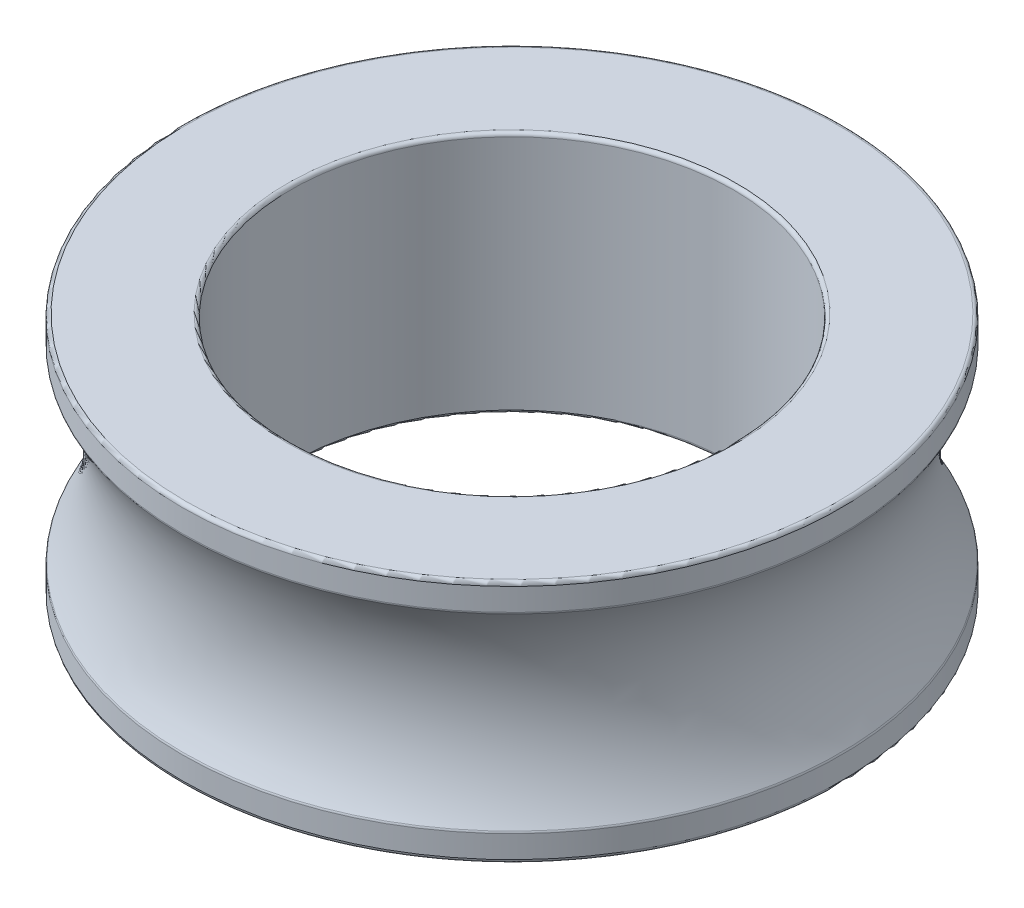
ISO-10303-21;
HEADER;
FILE_DESCRIPTION(('STEP AP214'),'2;1');
FILE_NAME('part.step','',(''),(''),'','','');
FILE_SCHEMA(('AUTOMOTIVE_DESIGN { 1 0 10303 214 1 1 1 1 }'));
ENDSEC;
DATA;
#1=APPLICATION_CONTEXT('core data for automotive mechanical design processes');
#2=APPLICATION_PROTOCOL_DEFINITION('international standard','automotive_design',2000,#1);
#3=PRODUCT_CONTEXT('',#1,'mechanical');
#4=PRODUCT('Part','Part','',(#3));
#5=PRODUCT_RELATED_PRODUCT_CATEGORY('part','',(#4));
#6=PRODUCT_DEFINITION_FORMATION('','',#4);
#7=PRODUCT_DEFINITION_CONTEXT('part definition',#1,'design');
#8=PRODUCT_DEFINITION('design','',#6,#7);
#9=PRODUCT_DEFINITION_SHAPE('','',#8);
#10=(LENGTH_UNIT() NAMED_UNIT(*) SI_UNIT(.MILLI.,.METRE.));
#11=(NAMED_UNIT(*) PLANE_ANGLE_UNIT() SI_UNIT($,.RADIAN.));
#12=(NAMED_UNIT(*) SI_UNIT($,.STERADIAN.) SOLID_ANGLE_UNIT());
#13=UNCERTAINTY_MEASURE_WITH_UNIT(LENGTH_MEASURE(1.E-05),#10,'distance_accuracy_value','');
#14=(GEOMETRIC_REPRESENTATION_CONTEXT(3) GLOBAL_UNCERTAINTY_ASSIGNED_CONTEXT((#13)) GLOBAL_UNIT_ASSIGNED_CONTEXT((#10,
#11,#12)) REPRESENTATION_CONTEXT('',''));
#15=CARTESIAN_POINT('',(0.,0.,0.));
#16=DIRECTION('',(0.,0.,1.));
#17=DIRECTION('',(1.,0.,0.));
#18=AXIS2_PLACEMENT_3D('',#15,#16,#17);
#19=CARTESIAN_POINT('',(0.,0.,0.));
#20=DIRECTION('',(0.,-1.,0.));
#21=DIRECTION('',(0.,0.,-1.));
#22=AXIS2_PLACEMENT_3D('',#19,#20,#21);
#23=CYLINDRICAL_SURFACE('',#22,6.125);
#24=CARTESIAN_POINT('',(0.,0.1,0.));
#25=DIRECTION('',(0.,-1.,0.));
#26=DIRECTION('',(0.,0.,-1.));
#27=AXIS2_PLACEMENT_3D('',#24,#25,#26);
#28=CIRCLE('',#27,6.125);
#29=CARTESIAN_POINT('',(0.,0.1,-6.125));
#30=VERTEX_POINT('',#29);
#31=EDGE_CURVE('E68',#30,#30,#28,.T.);
#32=ORIENTED_EDGE('',*,*,#31,.T.);
#33=EDGE_LOOP('',(#32));
#34=FACE_BOUND('',#33,.T.);
#35=CARTESIAN_POINT('',(0.,6.65,0.));
#36=DIRECTION('',(0.,1.,0.));
#37=DIRECTION('',(0.,0.,1.));
#38=AXIS2_PLACEMENT_3D('',#35,#36,#37);
#39=CIRCLE('',#38,6.125);
#40=CARTESIAN_POINT('',(0.,6.65,6.125));
#41=VERTEX_POINT('',#40);
#42=EDGE_CURVE('E71',#41,#41,#39,.T.);
#43=ORIENTED_EDGE('',*,*,#42,.T.);
#44=EDGE_LOOP('',(#43));
#45=FACE_BOUND('',#44,.T.);
#46=ADVANCED_FACE('F30',(#34,#45),#23,.F.);
#47=CARTESIAN_POINT('',(6.125,0.,0.));
#48=DIRECTION('',(0.,-1.,0.));
#49=DIRECTION('',(0.,0.,-1.));
#50=AXIS2_PLACEMENT_3D('',#47,#48,#49);
#51=PLANE('',#50);
#52=CARTESIAN_POINT('',(0.,0.,0.));
#53=DIRECTION('',(0.,-1.,0.));
#54=DIRECTION('',(0.,0.,-1.));
#55=AXIS2_PLACEMENT_3D('',#52,#53,#54);
#56=CIRCLE('',#55,6.225);
#57=CARTESIAN_POINT('',(0.,0.,-6.225));
#58=VERTEX_POINT('',#57);
#59=EDGE_CURVE('E62',#58,#58,#56,.F.);
#60=ORIENTED_EDGE('',*,*,#59,.T.);
#61=EDGE_LOOP('',(#60));
#62=FACE_BOUND('',#61,.T.);
#63=CARTESIAN_POINT('',(0.,0.,0.));
#64=DIRECTION('',(0.,-1.,0.));
#65=DIRECTION('',(0.,0.,-1.));
#66=AXIS2_PLACEMENT_3D('',#63,#64,#65);
#67=CIRCLE('',#66,9.025);
#68=CARTESIAN_POINT('',(0.,0.,-9.025));
#69=VERTEX_POINT('',#68);
#70=EDGE_CURVE('E65',#69,#69,#67,.T.);
#71=ORIENTED_EDGE('',*,*,#70,.T.);
#72=EDGE_LOOP('',(#71));
#73=FACE_BOUND('',#72,.T.);
#74=ADVANCED_FACE('F85',(#62,#73),#51,.T.);
#75=CARTESIAN_POINT('',(0.,0.,0.));
#76=DIRECTION('',(0.,-1.,0.));
#77=DIRECTION('',(0.,0.,-1.));
#78=AXIS2_PLACEMENT_3D('',#75,#76,#77);
#79=CYLINDRICAL_SURFACE('',#78,9.125);
#80=CARTESIAN_POINT('',(0.,0.1,0.));
#81=DIRECTION('',(0.,-1.,0.));
#82=DIRECTION('',(0.,0.,-1.));
#83=AXIS2_PLACEMENT_3D('',#80,#81,#82);
#84=CIRCLE('',#83,9.125);
#85=CARTESIAN_POINT('',(0.,0.1,-9.125));
#86=VERTEX_POINT('',#85);
#87=EDGE_CURVE('E56',#86,#86,#84,.F.);
#88=ORIENTED_EDGE('',*,*,#87,.T.);
#89=EDGE_LOOP('',(#88));
#90=FACE_BOUND('',#89,.T.);
#91=CARTESIAN_POINT('',(0.,0.72179009999726,0.));
#92=DIRECTION('',(0.,1.,0.));
#93=DIRECTION('',(0.,0.,1.));
#94=AXIS2_PLACEMENT_3D('',#91,#92,#93);
#95=CIRCLE('',#94,9.125);
#96=CARTESIAN_POINT('',(0.,0.72179009999726,9.125));
#97=VERTEX_POINT('',#96);
#98=EDGE_CURVE('E59',#97,#97,#95,.F.);
#99=ORIENTED_EDGE('',*,*,#98,.T.);
#100=EDGE_LOOP('',(#99));
#101=FACE_BOUND('',#100,.T.);
#102=ADVANCED_FACE('F91',(#90,#101),#79,.T.);
#103=CARTESIAN_POINT('',(0.,3.375,0.));
#104=DIRECTION('',(0.,-1.,0.));
#105=DIRECTION('',(0.,0.,-1.));
#106=AXIS2_PLACEMENT_3D('',#103,#104,#105);
#107=TOROIDAL_SURFACE('',#106,13.3805111326373,5.);
#108=CARTESIAN_POINT('',(0.,0.773813823526725,0.));
#109=DIRECTION('',(0.,1.,0.));
#110=DIRECTION('',(0.,0.,1.));
#111=AXIS2_PLACEMENT_3D('',#108,#109,#110);
#112=CIRCLE('',#111,9.11040217907132);
#113=CARTESIAN_POINT('',(0.,0.773813823526725,9.11040217907132));
#114=VERTEX_POINT('',#113);
#115=EDGE_CURVE('E50',#114,#114,#112,.T.);
#116=ORIENTED_EDGE('',*,*,#115,.T.);
#117=EDGE_LOOP('',(#116));
#118=FACE_BOUND('',#117,.T.);
#119=CARTESIAN_POINT('',(0.,5.97618617647327,0.));
#120=DIRECTION('',(0.,-1.,0.));
#121=DIRECTION('',(0.,0.,-1.));
#122=AXIS2_PLACEMENT_3D('',#119,#120,#121);
#123=CIRCLE('',#122,9.11040217907133);
#124=CARTESIAN_POINT('',(0.,5.97618617647327,-9.11040217907133));
#125=VERTEX_POINT('',#124);
#126=EDGE_CURVE('E53',#125,#125,#123,.T.);
#127=ORIENTED_EDGE('',*,*,#126,.T.);
#128=EDGE_LOOP('',(#127));
#129=FACE_BOUND('',#128,.T.);
#130=ADVANCED_FACE('F117',(#118,#129),#107,.F.);
#131=CARTESIAN_POINT('',(0.,0.,0.));
#132=DIRECTION('',(0.,-1.,0.));
#133=DIRECTION('',(0.,0.,-1.));
#134=AXIS2_PLACEMENT_3D('',#131,#132,#133);
#135=CYLINDRICAL_SURFACE('',#134,9.125);
#136=CARTESIAN_POINT('',(0.,6.02820990000274,0.));
#137=DIRECTION('',(0.,1.,0.));
#138=DIRECTION('',(0.,0.,1.));
#139=AXIS2_PLACEMENT_3D('',#136,#137,#138);
#140=CIRCLE('',#139,9.125);
#141=CARTESIAN_POINT('',(0.,6.02820990000274,9.125));
#142=VERTEX_POINT('',#141);
#143=EDGE_CURVE('E41',#142,#142,#140,.T.);
#144=ORIENTED_EDGE('',*,*,#143,.T.);
#145=EDGE_LOOP('',(#144));
#146=FACE_BOUND('',#145,.T.);
#147=CARTESIAN_POINT('',(0.,6.65,0.));
#148=DIRECTION('',(0.,1.,0.));
#149=DIRECTION('',(0.,0.,1.));
#150=AXIS2_PLACEMENT_3D('',#147,#148,#149);
#151=CIRCLE('',#150,9.125);
#152=CARTESIAN_POINT('',(0.,6.65,9.125));
#153=VERTEX_POINT('',#152);
#154=EDGE_CURVE('E45',#153,#153,#151,.F.);
#155=ORIENTED_EDGE('',*,*,#154,.T.);
#156=EDGE_LOOP('',(#155));
#157=FACE_BOUND('',#156,.T.);
#158=ADVANCED_FACE('F119',(#146,#157),#135,.T.);
#159=CARTESIAN_POINT('',(6.125,6.75,0.));
#160=DIRECTION('',(0.,1.,0.));
#161=DIRECTION('',(0.,0.,1.));
#162=AXIS2_PLACEMENT_3D('',#159,#160,#161);
#163=PLANE('',#162);
#164=CARTESIAN_POINT('',(0.,6.75,0.));
#165=DIRECTION('',(0.,1.,0.));
#166=DIRECTION('',(0.,0.,1.));
#167=AXIS2_PLACEMENT_3D('',#164,#165,#166);
#168=CIRCLE('',#167,9.025);
#169=CARTESIAN_POINT('',(0.,6.75,9.025));
#170=VERTEX_POINT('',#169);
#171=EDGE_CURVE('E10',#170,#170,#168,.T.);
#172=ORIENTED_EDGE('',*,*,#171,.T.);
#173=EDGE_LOOP('',(#172));
#174=FACE_BOUND('',#173,.T.);
#175=CARTESIAN_POINT('',(0.,6.75,0.));
#176=DIRECTION('',(0.,1.,0.));
#177=DIRECTION('',(0.,0.,1.));
#178=AXIS2_PLACEMENT_3D('',#175,#176,#177);
#179=CIRCLE('',#178,6.225);
#180=CARTESIAN_POINT('',(0.,6.75,6.225));
#181=VERTEX_POINT('',#180);
#182=EDGE_CURVE('E37',#181,#181,#179,.F.);
#183=ORIENTED_EDGE('',*,*,#182,.T.);
#184=EDGE_LOOP('',(#183));
#185=FACE_BOUND('',#184,.T.);
#186=ADVANCED_FACE('F100',(#174,#185),#163,.T.);
#187=CARTESIAN_POINT('',(0.,0.1,0.));
#188=DIRECTION('',(0.,-1.,0.));
#189=DIRECTION('',(0.,0.,-1.));
#190=AXIS2_PLACEMENT_3D('',#187,#188,#189);
#191=TOROIDAL_SURFACE('',#190,6.225,0.1);
#192=ORIENTED_EDGE('',*,*,#59,.F.);
#193=EDGE_LOOP('',(#192));
#194=FACE_BOUND('',#193,.T.);
#195=ORIENTED_EDGE('',*,*,#31,.F.);
#196=EDGE_LOOP('',(#195));
#197=FACE_BOUND('',#196,.T.);
#198=ADVANCED_FACE('F96',(#194,#197),#191,.T.);
#199=CARTESIAN_POINT('',(0.,0.1,0.));
#200=DIRECTION('',(0.,-1.,0.));
#201=DIRECTION('',(0.,0.,-1.));
#202=AXIS2_PLACEMENT_3D('',#199,#200,#201);
#203=TOROIDAL_SURFACE('',#202,9.025,0.1);
#204=ORIENTED_EDGE('',*,*,#87,.F.);
#205=EDGE_LOOP('',(#204));
#206=FACE_BOUND('',#205,.T.);
#207=ORIENTED_EDGE('',*,*,#70,.F.);
#208=EDGE_LOOP('',(#207));
#209=FACE_BOUND('',#208,.T.);
#210=ADVANCED_FACE('F99',(#206,#209),#203,.T.);
#211=CARTESIAN_POINT('',(0.,0.72179009999726,0.));
#212=DIRECTION('',(0.,1.,0.));
#213=DIRECTION('',(0.,0.,1.));
#214=AXIS2_PLACEMENT_3D('',#211,#212,#213);
#215=TOROIDAL_SURFACE('',#214,9.025,0.1);
#216=ORIENTED_EDGE('',*,*,#115,.F.);
#217=EDGE_LOOP('',(#216));
#218=FACE_BOUND('',#217,.T.);
#219=ORIENTED_EDGE('',*,*,#98,.F.);
#220=EDGE_LOOP('',(#219));
#221=FACE_BOUND('',#220,.T.);
#222=ADVANCED_FACE('F104',(#218,#221),#215,.T.);
#223=CARTESIAN_POINT('',(0.,6.02820990000274,0.));
#224=DIRECTION('',(0.,1.,0.));
#225=DIRECTION('',(0.,0.,1.));
#226=AXIS2_PLACEMENT_3D('',#223,#224,#225);
#227=TOROIDAL_SURFACE('',#226,9.025,0.1);
#228=ORIENTED_EDGE('',*,*,#143,.F.);
#229=EDGE_LOOP('',(#228));
#230=FACE_BOUND('',#229,.T.);
#231=ORIENTED_EDGE('',*,*,#126,.F.);
#232=EDGE_LOOP('',(#231));
#233=FACE_BOUND('',#232,.T.);
#234=ADVANCED_FACE('F82',(#230,#233),#227,.T.);
#235=CARTESIAN_POINT('',(0.,6.65,0.));
#236=DIRECTION('',(0.,1.,0.));
#237=DIRECTION('',(0.,0.,1.));
#238=AXIS2_PLACEMENT_3D('',#235,#236,#237);
#239=TOROIDAL_SURFACE('',#238,9.025,0.1);
#240=ORIENTED_EDGE('',*,*,#171,.F.);
#241=EDGE_LOOP('',(#240));
#242=FACE_BOUND('',#241,.T.);
#243=ORIENTED_EDGE('',*,*,#154,.F.);
#244=EDGE_LOOP('',(#243));
#245=FACE_BOUND('',#244,.T.);
#246=ADVANCED_FACE('F78',(#242,#245),#239,.T.);
#247=CARTESIAN_POINT('',(0.,6.65,0.));
#248=DIRECTION('',(0.,1.,0.));
#249=DIRECTION('',(0.,0.,1.));
#250=AXIS2_PLACEMENT_3D('',#247,#248,#249);
#251=TOROIDAL_SURFACE('',#250,6.225,0.1);
#252=ORIENTED_EDGE('',*,*,#42,.F.);
#253=EDGE_LOOP('',(#252));
#254=FACE_BOUND('',#253,.T.);
#255=ORIENTED_EDGE('',*,*,#182,.F.);
#256=EDGE_LOOP('',(#255));
#257=FACE_BOUND('',#256,.T.);
#258=ADVANCED_FACE('F32',(#254,#257),#251,.T.);
#259=CLOSED_SHELL('',(#46,#74,#102,#130,#158,#186,#198,#210,#222,#234,#246,#258));
#260=MANIFOLD_SOLID_BREP('B2',#259);
#261=ADVANCED_BREP_SHAPE_REPRESENTATION('',(#18,#260),#14);
#262=SHAPE_DEFINITION_REPRESENTATION(#9,#261);
ENDSEC;
END-ISO-10303-21;
